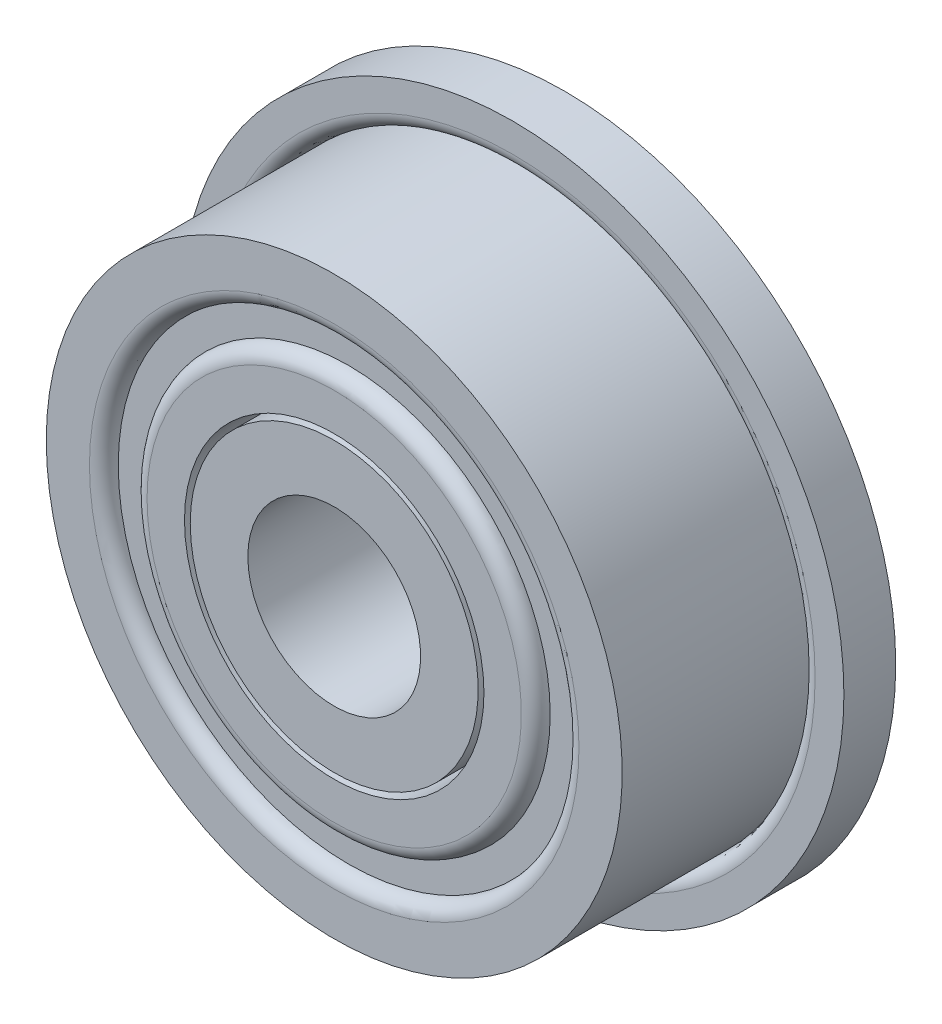
ISO-10303-21;
HEADER;
FILE_DESCRIPTION(('STEP AP214'),'2;1');
FILE_NAME('part.step','',(''),(''),'','','');
FILE_SCHEMA(('AUTOMOTIVE_DESIGN { 1 0 10303 214 1 1 1 1 }'));
ENDSEC;
DATA;
#1=APPLICATION_CONTEXT('core data for automotive mechanical design processes');
#2=APPLICATION_PROTOCOL_DEFINITION('international standard','automotive_design',2000,#1);
#3=PRODUCT_CONTEXT('',#1,'mechanical');
#4=PRODUCT('Part','Part','',(#3));
#5=PRODUCT_RELATED_PRODUCT_CATEGORY('part','',(#4));
#6=PRODUCT_DEFINITION_FORMATION('','',#4);
#7=PRODUCT_DEFINITION_CONTEXT('part definition',#1,'design');
#8=PRODUCT_DEFINITION('design','',#6,#7);
#9=PRODUCT_DEFINITION_SHAPE('','',#8);
#10=(LENGTH_UNIT() NAMED_UNIT(*) SI_UNIT(.MILLI.,.METRE.));
#11=(NAMED_UNIT(*) PLANE_ANGLE_UNIT() SI_UNIT($,.RADIAN.));
#12=(NAMED_UNIT(*) SI_UNIT($,.STERADIAN.) SOLID_ANGLE_UNIT());
#13=UNCERTAINTY_MEASURE_WITH_UNIT(LENGTH_MEASURE(1.E-05),#10,'distance_accuracy_value','');
#14=(GEOMETRIC_REPRESENTATION_CONTEXT(3) GLOBAL_UNCERTAINTY_ASSIGNED_CONTEXT((#13)) GLOBAL_UNIT_ASSIGNED_CONTEXT((#10,
#11,#12)) REPRESENTATION_CONTEXT('',''));
#15=CARTESIAN_POINT('',(0.,0.,0.));
#16=DIRECTION('',(0.,0.,1.));
#17=DIRECTION('',(1.,0.,0.));
#18=AXIS2_PLACEMENT_3D('',#15,#16,#17);
#19=CARTESIAN_POINT('',(0.,0.,0.));
#20=DIRECTION('',(0.,0.,1.));
#21=DIRECTION('',(1.,0.,0.));
#22=AXIS2_PLACEMENT_3D('',#19,#20,#21);
#23=CYLINDRICAL_SURFACE('',#22,2.5);
#24=CARTESIAN_POINT('',(0.,0.,2.));
#25=DIRECTION('',(0.,0.,-1.));
#26=DIRECTION('',(1.,0.,0.));
#27=AXIS2_PLACEMENT_3D('',#24,#25,#26);
#28=CIRCLE('',#27,2.5);
#29=CARTESIAN_POINT('',(-2.5,0.,2.));
#30=VERTEX_POINT('',#29);
#31=EDGE_CURVE('E10',#30,#30,#28,.T.);
#32=ORIENTED_EDGE('',*,*,#31,.T.);
#33=DIRECTION('',(0.,0.,-1.));
#34=VECTOR('',#33,1.);
#35=CARTESIAN_POINT('',(-2.5,0.,0.));
#36=LINE('',#35,#34);
#37=CARTESIAN_POINT('',(-2.5,0.,0.));
#38=VERTEX_POINT('',#37);
#39=EDGE_CURVE('E27',#30,#38,#36,.T.);
#40=ORIENTED_EDGE('',*,*,#39,.T.);
#41=CARTESIAN_POINT('',(0.,0.,0.));
#42=DIRECTION('',(0.,0.,1.));
#43=DIRECTION('',(1.,0.,0.));
#44=AXIS2_PLACEMENT_3D('',#41,#42,#43);
#45=CIRCLE('',#44,2.5);
#46=EDGE_CURVE('E255',#38,#38,#45,.T.);
#47=ORIENTED_EDGE('',*,*,#46,.T.);
#48=ORIENTED_EDGE('',*,*,#39,.F.);
#49=EDGE_LOOP('',(#32,#40,#47,#48));
#50=FACE_BOUND('',#49,.T.);
#51=ADVANCED_FACE('F16',(#50),#23,.T.);
#52=CARTESIAN_POINT('',(0.,0.,0.));
#53=DIRECTION('',(0.,0.,1.));
#54=DIRECTION('',(1.,0.,0.));
#55=AXIS2_PLACEMENT_3D('',#52,#53,#54);
#56=CYLINDRICAL_SURFACE('',#55,2.5);
#57=CARTESIAN_POINT('',(0.,0.,4.));
#58=DIRECTION('',(0.,0.,1.));
#59=DIRECTION('',(1.,0.,0.));
#60=AXIS2_PLACEMENT_3D('',#57,#58,#59);
#61=CIRCLE('',#60,2.5);
#62=CARTESIAN_POINT('',(-2.5,0.,4.));
#63=VERTEX_POINT('',#62);
#64=EDGE_CURVE('E221',#63,#63,#61,.T.);
#65=ORIENTED_EDGE('',*,*,#64,.F.);
#66=DIRECTION('',(0.,0.,-1.));
#67=VECTOR('',#66,1.);
#68=CARTESIAN_POINT('',(-2.5,0.,0.));
#69=LINE('',#68,#67);
#70=CARTESIAN_POINT('',(-2.5,0.,2.1));
#71=VERTEX_POINT('',#70);
#72=EDGE_CURVE('E251',#63,#71,#69,.T.);
#73=ORIENTED_EDGE('',*,*,#72,.T.);
#74=CARTESIAN_POINT('',(0.,0.,2.1));
#75=DIRECTION('',(0.,0.,-1.));
#76=DIRECTION('',(1.,0.,0.));
#77=AXIS2_PLACEMENT_3D('',#74,#75,#76);
#78=CIRCLE('',#77,2.5);
#79=EDGE_CURVE('E263',#71,#71,#78,.T.);
#80=ORIENTED_EDGE('',*,*,#79,.F.);
#81=ORIENTED_EDGE('',*,*,#72,.F.);
#82=EDGE_LOOP('',(#65,#73,#80,#81));
#83=FACE_BOUND('',#82,.T.);
#84=ADVANCED_FACE('F320',(#83),#56,.T.);
#85=CARTESIAN_POINT('',(0.,0.,0.));
#86=DIRECTION('',(0.,0.,1.));
#87=DIRECTION('',(1.,0.,0.));
#88=AXIS2_PLACEMENT_3D('',#85,#86,#87);
#89=CYLINDRICAL_SURFACE('',#88,1.5);
#90=CARTESIAN_POINT('',(0.,0.,4.));
#91=DIRECTION('',(0.,0.,-1.));
#92=DIRECTION('',(1.,0.,0.));
#93=AXIS2_PLACEMENT_3D('',#90,#91,#92);
#94=CIRCLE('',#93,1.5);
#95=CARTESIAN_POINT('',(-1.5,0.,4.));
#96=VERTEX_POINT('',#95);
#97=EDGE_CURVE('E270',#96,#96,#94,.T.);
#98=ORIENTED_EDGE('',*,*,#97,.F.);
#99=DIRECTION('',(0.,0.,-1.));
#100=VECTOR('',#99,1.);
#101=CARTESIAN_POINT('',(-1.5,0.,0.));
#102=LINE('',#101,#100);
#103=CARTESIAN_POINT('',(-1.5,0.,0.));
#104=VERTEX_POINT('',#103);
#105=EDGE_CURVE('E220',#96,#104,#102,.T.);
#106=ORIENTED_EDGE('',*,*,#105,.T.);
#107=CARTESIAN_POINT('',(0.,0.,0.));
#108=DIRECTION('',(0.,0.,-1.));
#109=DIRECTION('',(1.,0.,0.));
#110=AXIS2_PLACEMENT_3D('',#107,#108,#109);
#111=CIRCLE('',#110,1.5);
#112=EDGE_CURVE('E216',#104,#104,#111,.T.);
#113=ORIENTED_EDGE('',*,*,#112,.T.);
#114=ORIENTED_EDGE('',*,*,#105,.F.);
#115=EDGE_LOOP('',(#98,#106,#113,#114));
#116=FACE_BOUND('',#115,.T.);
#117=ADVANCED_FACE('F325',(#116),#89,.F.);
#118=CARTESIAN_POINT('',(0.,0.,4.));
#119=DIRECTION('',(0.,0.,1.));
#120=DIRECTION('',(1.,0.,0.));
#121=AXIS2_PLACEMENT_3D('',#118,#119,#120);
#122=PLANE('',#121);
#123=ORIENTED_EDGE('',*,*,#64,.T.);
#124=EDGE_LOOP('',(#123));
#125=FACE_BOUND('',#124,.T.);
#126=ORIENTED_EDGE('',*,*,#97,.T.);
#127=EDGE_LOOP('',(#126));
#128=FACE_BOUND('',#127,.T.);
#129=ADVANCED_FACE('F322',(#125,#128),#122,.T.);
#130=CARTESIAN_POINT('',(0.,0.,0.));
#131=DIRECTION('',(0.,0.,1.));
#132=DIRECTION('',(1.,0.,0.));
#133=AXIS2_PLACEMENT_3D('',#130,#131,#132);
#134=PLANE('',#133);
#135=ORIENTED_EDGE('',*,*,#46,.F.);
#136=EDGE_LOOP('',(#135));
#137=FACE_BOUND('',#136,.T.);
#138=ORIENTED_EDGE('',*,*,#112,.F.);
#139=EDGE_LOOP('',(#138));
#140=FACE_BOUND('',#139,.T.);
#141=ADVANCED_FACE('F316',(#137,#140),#134,.F.);
#142=CARTESIAN_POINT('',(0.,0.,2.1));
#143=DIRECTION('',(0.,0.,1.));
#144=DIRECTION('',(1.,0.,0.));
#145=AXIS2_PLACEMENT_3D('',#142,#143,#144);
#146=PLANE('',#145);
#147=CARTESIAN_POINT('',(0.,0.,2.1));
#148=DIRECTION('',(0.,0.,-1.));
#149=DIRECTION('',(1.,0.,0.));
#150=AXIS2_PLACEMENT_3D('',#147,#148,#149);
#151=CIRCLE('',#150,2.6);
#152=CARTESIAN_POINT('',(-2.6,0.,2.1));
#153=VERTEX_POINT('',#152);
#154=EDGE_CURVE('E183',#153,#153,#151,.T.);
#155=ORIENTED_EDGE('',*,*,#154,.F.);
#156=EDGE_LOOP('',(#155));
#157=FACE_BOUND('',#156,.T.);
#158=ORIENTED_EDGE('',*,*,#79,.T.);
#159=EDGE_LOOP('',(#158));
#160=FACE_BOUND('',#159,.T.);
#161=ADVANCED_FACE('F312',(#157,#160),#146,.T.);
#162=CARTESIAN_POINT('',(0.,0.,2.));
#163=DIRECTION('',(0.,0.,1.));
#164=DIRECTION('',(1.,0.,0.));
#165=AXIS2_PLACEMENT_3D('',#162,#163,#164);
#166=PLANE('',#165);
#167=CARTESIAN_POINT('',(0.,0.,2.));
#168=DIRECTION('',(0.,0.,1.));
#169=DIRECTION('',(1.,0.,0.));
#170=AXIS2_PLACEMENT_3D('',#167,#168,#169);
#171=CIRCLE('',#170,2.6);
#172=CARTESIAN_POINT('',(-2.6,0.,2.));
#173=VERTEX_POINT('',#172);
#174=EDGE_CURVE('E259',#173,#173,#171,.T.);
#175=ORIENTED_EDGE('',*,*,#174,.F.);
#176=EDGE_LOOP('',(#175));
#177=FACE_BOUND('',#176,.T.);
#178=ORIENTED_EDGE('',*,*,#31,.F.);
#179=EDGE_LOOP('',(#178));
#180=FACE_BOUND('',#179,.T.);
#181=ADVANCED_FACE('F315',(#177,#180),#166,.F.);
#182=CARTESIAN_POINT('',(0.,0.,0.));
#183=DIRECTION('',(0.,0.,1.));
#184=DIRECTION('',(1.,0.,0.));
#185=AXIS2_PLACEMENT_3D('',#182,#183,#184);
#186=CYLINDRICAL_SURFACE('',#185,2.6);
#187=ORIENTED_EDGE('',*,*,#174,.T.);
#188=DIRECTION('',(0.,0.,-1.));
#189=VECTOR('',#188,1.);
#190=CARTESIAN_POINT('',(-2.6,0.,0.));
#191=LINE('',#190,#189);
#192=CARTESIAN_POINT('',(-2.6,0.,0.));
#193=VERTEX_POINT('',#192);
#194=EDGE_CURVE('E232',#173,#193,#191,.T.);
#195=ORIENTED_EDGE('',*,*,#194,.T.);
#196=CARTESIAN_POINT('',(0.,0.,0.));
#197=DIRECTION('',(0.,0.,-1.));
#198=DIRECTION('',(1.,0.,0.));
#199=AXIS2_PLACEMENT_3D('',#196,#197,#198);
#200=CIRCLE('',#199,2.6);
#201=EDGE_CURVE('E214',#193,#193,#200,.T.);
#202=ORIENTED_EDGE('',*,*,#201,.T.);
#203=ORIENTED_EDGE('',*,*,#194,.F.);
#204=EDGE_LOOP('',(#187,#195,#202,#203));
#205=FACE_BOUND('',#204,.T.);
#206=ADVANCED_FACE('F340',(#205),#186,.F.);
#207=CARTESIAN_POINT('',(0.,0.,3.75));
#208=DIRECTION('',(0.,0.,1.));
#209=DIRECTION('',(1.,0.,0.));
#210=AXIS2_PLACEMENT_3D('',#207,#208,#209);
#211=PLANE('',#210);
#212=CARTESIAN_POINT('',(0.,0.,3.75));
#213=DIRECTION('',(0.,0.,-1.));
#214=DIRECTION('',(1.,0.,0.));
#215=AXIS2_PLACEMENT_3D('',#212,#213,#214);
#216=CIRCLE('',#215,4.);
#217=CARTESIAN_POINT('',(-4.,0.,3.75));
#218=VERTEX_POINT('',#217);
#219=CARTESIAN_POINT('',(4.,0.,3.75));
#220=VERTEX_POINT('',#219);
#221=EDGE_CURVE('E20',#218,#220,#216,.T.);
#222=ORIENTED_EDGE('',*,*,#221,.F.);
#223=CARTESIAN_POINT('',(0.,0.,3.75));
#224=DIRECTION('',(0.,0.,-1.));
#225=DIRECTION('',(1.,0.,0.));
#226=AXIS2_PLACEMENT_3D('',#223,#224,#225);
#227=CIRCLE('',#226,4.);
#228=EDGE_CURVE('E167',#220,#218,#227,.T.);
#229=ORIENTED_EDGE('',*,*,#228,.F.);
#230=EDGE_LOOP('',(#222,#229));
#231=FACE_BOUND('',#230,.T.);
#232=CARTESIAN_POINT('',(0.,0.,3.75));
#233=DIRECTION('',(0.,0.,1.));
#234=DIRECTION('',(1.,0.,0.));
#235=AXIS2_PLACEMENT_3D('',#232,#233,#234);
#236=CIRCLE('',#235,3.5);
#237=CARTESIAN_POINT('',(-3.5,0.,3.75));
#238=VERTEX_POINT('',#237);
#239=EDGE_CURVE('E225',#238,#238,#236,.T.);
#240=ORIENTED_EDGE('',*,*,#239,.F.);
#241=EDGE_LOOP('',(#240));
#242=FACE_BOUND('',#241,.T.);
#243=ADVANCED_FACE('F348',(#231,#242),#211,.T.);
#244=CARTESIAN_POINT('',(0.,0.,3.75));
#245=DIRECTION('',(0.,0.,1.));
#246=DIRECTION('',(1.,0.,0.));
#247=AXIS2_PLACEMENT_3D('',#244,#245,#246);
#248=TOROIDAL_SURFACE('',#247,3.25,0.25);
#249=CARTESIAN_POINT('',(0.,0.,4.));
#250=DIRECTION('',(0.,0.,-1.));
#251=DIRECTION('',(1.,0.,0.));
#252=AXIS2_PLACEMENT_3D('',#249,#250,#251);
#253=CIRCLE('',#252,3.25);
#254=CARTESIAN_POINT('',(-3.25,0.,4.));
#255=VERTEX_POINT('',#254);
#256=EDGE_CURVE('E210',#255,#255,#253,.T.);
#257=ORIENTED_EDGE('',*,*,#256,.T.);
#258=CARTESIAN_POINT('',(-3.25,0.,3.75));
#259=DIRECTION('',(0.,-1.,0.));
#260=DIRECTION('',(-1.,0.,0.));
#261=AXIS2_PLACEMENT_3D('',#258,#259,#260);
#262=CIRCLE('',#261,0.25);
#263=EDGE_CURVE('E215',#255,#238,#262,.T.);
#264=ORIENTED_EDGE('',*,*,#263,.T.);
#265=ORIENTED_EDGE('',*,*,#239,.T.);
#266=ORIENTED_EDGE('',*,*,#263,.F.);
#267=EDGE_LOOP('',(#257,#264,#265,#266));
#268=FACE_BOUND('',#267,.T.);
#269=ADVANCED_FACE('F302',(#268),#248,.T.);
#270=CARTESIAN_POINT('',(0.,0.,4.));
#271=DIRECTION('',(0.,0.,1.));
#272=DIRECTION('',(1.,0.,0.));
#273=AXIS2_PLACEMENT_3D('',#270,#271,#272);
#274=PLANE('',#273);
#275=ORIENTED_EDGE('',*,*,#256,.F.);
#276=EDGE_LOOP('',(#275));
#277=FACE_BOUND('',#276,.T.);
#278=CARTESIAN_POINT('',(0.,0.,4.));
#279=DIRECTION('',(0.,0.,-1.));
#280=DIRECTION('',(1.,0.,0.));
#281=AXIS2_PLACEMENT_3D('',#278,#279,#280);
#282=CIRCLE('',#281,2.6);
#283=CARTESIAN_POINT('',(-2.6,0.,4.));
#284=VERTEX_POINT('',#283);
#285=EDGE_CURVE('E155',#284,#284,#282,.T.);
#286=ORIENTED_EDGE('',*,*,#285,.T.);
#287=EDGE_LOOP('',(#286));
#288=FACE_BOUND('',#287,.T.);
#289=ADVANCED_FACE('F304',(#277,#288),#274,.T.);
#290=CARTESIAN_POINT('',(0.,0.,3.75));
#291=DIRECTION('',(0.,0.,-1.));
#292=DIRECTION('',(-1.,0.,0.));
#293=AXIS2_PLACEMENT_3D('',#290,#291,#292);
#294=TOROIDAL_SURFACE('',#293,4.25,0.25);
#295=CARTESIAN_POINT('',(0.,0.,4.));
#296=DIRECTION('',(0.,0.,1.));
#297=DIRECTION('',(1.,0.,0.));
#298=AXIS2_PLACEMENT_3D('',#295,#296,#297);
#299=CIRCLE('',#298,4.25);
#300=CARTESIAN_POINT('',(-4.25,0.,4.));
#301=VERTEX_POINT('',#300);
#302=CARTESIAN_POINT('',(4.25,0.,4.));
#303=VERTEX_POINT('',#302);
#304=EDGE_CURVE('E148',#301,#303,#299,.T.);
#305=ORIENTED_EDGE('',*,*,#304,.T.);
#306=CARTESIAN_POINT('',(4.25,0.,3.75));
#307=DIRECTION('',(0.,-1.,0.));
#308=DIRECTION('',(1.,0.,0.));
#309=AXIS2_PLACEMENT_3D('',#306,#307,#308);
#310=CIRCLE('',#309,0.25);
#311=EDGE_CURVE('E156',#303,#220,#310,.T.);
#312=ORIENTED_EDGE('',*,*,#311,.T.);
#313=ORIENTED_EDGE('',*,*,#228,.T.);
#314=ORIENTED_EDGE('',*,*,#221,.T.);
#315=ORIENTED_EDGE('',*,*,#311,.F.);
#316=CARTESIAN_POINT('',(0.,0.,4.));
#317=DIRECTION('',(0.,0.,1.));
#318=DIRECTION('',(1.,0.,0.));
#319=AXIS2_PLACEMENT_3D('',#316,#317,#318);
#320=CIRCLE('',#319,4.25);
#321=EDGE_CURVE('E151',#303,#301,#320,.T.);
#322=ORIENTED_EDGE('',*,*,#321,.T.);
#323=EDGE_LOOP('',(#305,#312,#313,#314,#315,#322));
#324=FACE_BOUND('',#323,.T.);
#325=ADVANCED_FACE('F158',(#324),#294,.T.);
#326=CARTESIAN_POINT('',(0.,0.,4.));
#327=DIRECTION('',(0.,0.,1.));
#328=DIRECTION('',(1.,0.,0.));
#329=AXIS2_PLACEMENT_3D('',#326,#327,#328);
#330=PLANE('',#329);
#331=CARTESIAN_POINT('',(0.,0.,4.));
#332=DIRECTION('',(0.,0.,1.));
#333=DIRECTION('',(1.,0.,0.));
#334=AXIS2_PLACEMENT_3D('',#331,#332,#333);
#335=CIRCLE('',#334,5.);
#336=CARTESIAN_POINT('',(-5.,0.,4.));
#337=VERTEX_POINT('',#336);
#338=EDGE_CURVE('E160',#337,#337,#335,.T.);
#339=ORIENTED_EDGE('',*,*,#338,.T.);
#340=EDGE_LOOP('',(#339));
#341=FACE_BOUND('',#340,.T.);
#342=ORIENTED_EDGE('',*,*,#304,.F.);
#343=ORIENTED_EDGE('',*,*,#321,.F.);
#344=EDGE_LOOP('',(#342,#343));
#345=FACE_BOUND('',#344,.T.);
#346=ADVANCED_FACE('F150',(#341,#345),#330,.T.);
#347=CARTESIAN_POINT('',(0.,0.,0.25));
#348=DIRECTION('',(0.,0.,1.));
#349=DIRECTION('',(1.,0.,0.));
#350=AXIS2_PLACEMENT_3D('',#347,#348,#349);
#351=TOROIDAL_SURFACE('',#350,3.25,0.25);
#352=CARTESIAN_POINT('',(0.,0.,0.25));
#353=DIRECTION('',(0.,0.,-1.));
#354=DIRECTION('',(1.,0.,0.));
#355=AXIS2_PLACEMENT_3D('',#352,#353,#354);
#356=CIRCLE('',#355,3.5);
#357=CARTESIAN_POINT('',(-3.5,0.,0.25));
#358=VERTEX_POINT('',#357);
#359=EDGE_CURVE('E169',#358,#358,#356,.T.);
#360=ORIENTED_EDGE('',*,*,#359,.T.);
#361=CARTESIAN_POINT('',(-3.25,0.,0.25));
#362=DIRECTION('',(0.,-1.,0.));
#363=DIRECTION('',(-1.,0.,0.));
#364=AXIS2_PLACEMENT_3D('',#361,#362,#363);
#365=CIRCLE('',#364,0.25);
#366=CARTESIAN_POINT('',(-3.25,0.,0.));
#367=VERTEX_POINT('',#366);
#368=EDGE_CURVE('E174',#358,#367,#365,.T.);
#369=ORIENTED_EDGE('',*,*,#368,.T.);
#370=CARTESIAN_POINT('',(0.,0.,0.));
#371=DIRECTION('',(0.,0.,1.));
#372=DIRECTION('',(1.,0.,0.));
#373=AXIS2_PLACEMENT_3D('',#370,#371,#372);
#374=CIRCLE('',#373,3.25);
#375=EDGE_CURVE('E178',#367,#367,#374,.T.);
#376=ORIENTED_EDGE('',*,*,#375,.T.);
#377=ORIENTED_EDGE('',*,*,#368,.F.);
#378=EDGE_LOOP('',(#360,#369,#376,#377));
#379=FACE_BOUND('',#378,.T.);
#380=ADVANCED_FACE('F18',(#379),#351,.T.);
#381=CARTESIAN_POINT('',(0.,0.,0.));
#382=DIRECTION('',(0.,0.,1.));
#383=DIRECTION('',(1.,0.,0.));
#384=AXIS2_PLACEMENT_3D('',#381,#382,#383);
#385=PLANE('',#384);
#386=ORIENTED_EDGE('',*,*,#375,.F.);
#387=EDGE_LOOP('',(#386));
#388=FACE_BOUND('',#387,.T.);
#389=ORIENTED_EDGE('',*,*,#201,.F.);
#390=EDGE_LOOP('',(#389));
#391=FACE_BOUND('',#390,.T.);
#392=ADVANCED_FACE('F384',(#388,#391),#385,.F.);
#393=CARTESIAN_POINT('',(0.,0.,0.));
#394=DIRECTION('',(0.,0.,1.));
#395=DIRECTION('',(1.,0.,0.));
#396=AXIS2_PLACEMENT_3D('',#393,#394,#395);
#397=CYLINDRICAL_SURFACE('',#396,2.6);
#398=ORIENTED_EDGE('',*,*,#285,.F.);
#399=DIRECTION('',(0.,0.,-1.));
#400=VECTOR('',#399,1.);
#401=CARTESIAN_POINT('',(-2.6,0.,0.));
#402=LINE('',#401,#400);
#403=EDGE_CURVE('E236',#284,#153,#402,.T.);
#404=ORIENTED_EDGE('',*,*,#403,.T.);
#405=ORIENTED_EDGE('',*,*,#154,.T.);
#406=ORIENTED_EDGE('',*,*,#403,.F.);
#407=EDGE_LOOP('',(#398,#404,#405,#406));
#408=FACE_BOUND('',#407,.T.);
#409=ADVANCED_FACE('F310',(#408),#397,.F.);
#410=CARTESIAN_POINT('',(0.,0.,0.25));
#411=DIRECTION('',(0.,0.,1.));
#412=DIRECTION('',(1.,0.,0.));
#413=AXIS2_PLACEMENT_3D('',#410,#411,#412);
#414=PLANE('',#413);
#415=CARTESIAN_POINT('',(0.,0.,0.25));
#416=DIRECTION('',(0.,0.,1.));
#417=DIRECTION('',(1.,0.,0.));
#418=AXIS2_PLACEMENT_3D('',#415,#416,#417);
#419=CIRCLE('',#418,4.);
#420=CARTESIAN_POINT('',(-4.,0.,0.25));
#421=VERTEX_POINT('',#420);
#422=CARTESIAN_POINT('',(4.,0.,0.25));
#423=VERTEX_POINT('',#422);
#424=EDGE_CURVE('E179',#421,#423,#419,.T.);
#425=ORIENTED_EDGE('',*,*,#424,.F.);
#426=CARTESIAN_POINT('',(0.,0.,0.25));
#427=DIRECTION('',(0.,0.,1.));
#428=DIRECTION('',(1.,0.,0.));
#429=AXIS2_PLACEMENT_3D('',#426,#427,#428);
#430=CIRCLE('',#429,4.);
#431=EDGE_CURVE('E193',#423,#421,#430,.T.);
#432=ORIENTED_EDGE('',*,*,#431,.F.);
#433=EDGE_LOOP('',(#425,#432));
#434=FACE_BOUND('',#433,.T.);
#435=ORIENTED_EDGE('',*,*,#359,.F.);
#436=EDGE_LOOP('',(#435));
#437=FACE_BOUND('',#436,.T.);
#438=ADVANCED_FACE('F391',(#434,#437),#414,.F.);
#439=CARTESIAN_POINT('',(0.,0.,0.25));
#440=DIRECTION('',(0.,0.,-1.));
#441=DIRECTION('',(-1.,0.,0.));
#442=AXIS2_PLACEMENT_3D('',#439,#440,#441);
#443=TOROIDAL_SURFACE('',#442,4.25,0.25);
#444=ORIENTED_EDGE('',*,*,#424,.T.);
#445=CARTESIAN_POINT('',(4.25,0.,0.25));
#446=DIRECTION('',(0.,-1.,0.));
#447=DIRECTION('',(1.,0.,0.));
#448=AXIS2_PLACEMENT_3D('',#445,#446,#447);
#449=CIRCLE('',#448,0.25);
#450=CARTESIAN_POINT('',(4.25,0.,0.));
#451=VERTEX_POINT('',#450);
#452=EDGE_CURVE('E184',#423,#451,#449,.T.);
#453=ORIENTED_EDGE('',*,*,#452,.T.);
#454=CARTESIAN_POINT('',(0.,0.,0.));
#455=DIRECTION('',(0.,0.,-1.));
#456=DIRECTION('',(1.,0.,0.));
#457=AXIS2_PLACEMENT_3D('',#454,#455,#456);
#458=CIRCLE('',#457,4.25);
#459=CARTESIAN_POINT('',(-4.25,0.,0.));
#460=VERTEX_POINT('',#459);
#461=EDGE_CURVE('E256',#451,#460,#458,.T.);
#462=ORIENTED_EDGE('',*,*,#461,.T.);
#463=CARTESIAN_POINT('',(0.,0.,0.));
#464=DIRECTION('',(0.,0.,-1.));
#465=DIRECTION('',(1.,0.,0.));
#466=AXIS2_PLACEMENT_3D('',#463,#464,#465);
#467=CIRCLE('',#466,4.25);
#468=EDGE_CURVE('E196',#460,#451,#467,.T.);
#469=ORIENTED_EDGE('',*,*,#468,.T.);
#470=ORIENTED_EDGE('',*,*,#452,.F.);
#471=ORIENTED_EDGE('',*,*,#431,.T.);
#472=EDGE_LOOP('',(#444,#453,#462,#469,#470,#471));
#473=FACE_BOUND('',#472,.T.);
#474=ADVANCED_FACE('F371',(#473),#443,.T.);
#475=CARTESIAN_POINT('',(0.,0.,0.));
#476=DIRECTION('',(0.,0.,1.));
#477=DIRECTION('',(1.,0.,0.));
#478=AXIS2_PLACEMENT_3D('',#475,#476,#477);
#479=PLANE('',#478);
#480=CARTESIAN_POINT('',(0.,0.,0.));
#481=DIRECTION('',(0.,0.,1.));
#482=DIRECTION('',(1.,0.,0.));
#483=AXIS2_PLACEMENT_3D('',#480,#481,#482);
#484=CIRCLE('',#483,5.75);
#485=CARTESIAN_POINT('',(-5.75,0.,0.));
#486=VERTEX_POINT('',#485);
#487=EDGE_CURVE('E185',#486,#486,#484,.T.);
#488=ORIENTED_EDGE('',*,*,#487,.F.);
#489=EDGE_LOOP('',(#488));
#490=FACE_BOUND('',#489,.T.);
#491=ORIENTED_EDGE('',*,*,#468,.F.);
#492=ORIENTED_EDGE('',*,*,#461,.F.);
#493=EDGE_LOOP('',(#491,#492));
#494=FACE_BOUND('',#493,.T.);
#495=ADVANCED_FACE('F362',(#490,#494),#479,.F.);
#496=CARTESIAN_POINT('',(0.,0.,0.));
#497=DIRECTION('',(0.,0.,1.));
#498=DIRECTION('',(1.,0.,0.));
#499=AXIS2_PLACEMENT_3D('',#496,#497,#498);
#500=CYLINDRICAL_SURFACE('',#499,5.);
#501=ORIENTED_EDGE('',*,*,#338,.F.);
#502=DIRECTION('',(0.,0.,-1.));
#503=VECTOR('',#502,1.);
#504=CARTESIAN_POINT('',(-5.,0.,0.));
#505=LINE('',#504,#503);
#506=CARTESIAN_POINT('',(-5.,0.,0.65));
#507=VERTEX_POINT('',#506);
#508=EDGE_CURVE('E197',#337,#507,#505,.T.);
#509=ORIENTED_EDGE('',*,*,#508,.T.);
#510=CARTESIAN_POINT('',(0.,0.,0.65));
#511=DIRECTION('',(0.,0.,-1.));
#512=DIRECTION('',(1.,0.,0.));
#513=AXIS2_PLACEMENT_3D('',#510,#511,#512);
#514=CIRCLE('',#513,5.);
#515=CARTESIAN_POINT('',(5.,0.,0.65));
#516=VERTEX_POINT('',#515);
#517=EDGE_CURVE('E250',#516,#507,#514,.T.);
#518=ORIENTED_EDGE('',*,*,#517,.F.);
#519=CARTESIAN_POINT('',(0.,0.,0.65));
#520=DIRECTION('',(0.,0.,-1.));
#521=DIRECTION('',(1.,0.,0.));
#522=AXIS2_PLACEMENT_3D('',#519,#520,#521);
#523=CIRCLE('',#522,5.);
#524=EDGE_CURVE('E203',#507,#516,#523,.T.);
#525=ORIENTED_EDGE('',*,*,#524,.F.);
#526=ORIENTED_EDGE('',*,*,#508,.F.);
#527=EDGE_LOOP('',(#501,#509,#518,#525,#526));
#528=FACE_BOUND('',#527,.T.);
#529=ADVANCED_FACE('F359',(#528),#500,.T.);
#530=CARTESIAN_POINT('',(0.,0.,0.65));
#531=DIRECTION('',(0.,0.,-1.));
#532=DIRECTION('',(-1.,0.,0.));
#533=AXIS2_PLACEMENT_3D('',#530,#531,#532);
#534=TOROIDAL_SURFACE('',#533,5.25,0.25);
#535=CARTESIAN_POINT('',(0.,0.,0.9));
#536=DIRECTION('',(0.,0.,1.));
#537=DIRECTION('',(1.,0.,0.));
#538=AXIS2_PLACEMENT_3D('',#535,#536,#537);
#539=CIRCLE('',#538,5.25);
#540=CARTESIAN_POINT('',(-5.25,0.,0.9));
#541=VERTEX_POINT('',#540);
#542=CARTESIAN_POINT('',(5.25,0.,0.9));
#543=VERTEX_POINT('',#542);
#544=EDGE_CURVE('E205',#541,#543,#539,.T.);
#545=ORIENTED_EDGE('',*,*,#544,.T.);
#546=CARTESIAN_POINT('',(5.25,0.,0.65));
#547=DIRECTION('',(0.,-1.,0.));
#548=DIRECTION('',(1.,0.,0.));
#549=AXIS2_PLACEMENT_3D('',#546,#547,#548);
#550=CIRCLE('',#549,0.25);
#551=EDGE_CURVE('E209',#543,#516,#550,.T.);
#552=ORIENTED_EDGE('',*,*,#551,.T.);
#553=ORIENTED_EDGE('',*,*,#517,.T.);
#554=ORIENTED_EDGE('',*,*,#524,.T.);
#555=ORIENTED_EDGE('',*,*,#551,.F.);
#556=CARTESIAN_POINT('',(0.,0.,0.9));
#557=DIRECTION('',(0.,0.,1.));
#558=DIRECTION('',(1.,0.,0.));
#559=AXIS2_PLACEMENT_3D('',#556,#557,#558);
#560=CIRCLE('',#559,5.25);
#561=EDGE_CURVE('E199',#543,#541,#560,.T.);
#562=ORIENTED_EDGE('',*,*,#561,.T.);
#563=EDGE_LOOP('',(#545,#552,#553,#554,#555,#562));
#564=FACE_BOUND('',#563,.T.);
#565=ADVANCED_FACE('F361',(#564),#534,.T.);
#566=CARTESIAN_POINT('',(0.,0.,0.9));
#567=DIRECTION('',(0.,0.,1.));
#568=DIRECTION('',(1.,0.,0.));
#569=AXIS2_PLACEMENT_3D('',#566,#567,#568);
#570=PLANE('',#569);
#571=CARTESIAN_POINT('',(0.,0.,0.9));
#572=DIRECTION('',(0.,0.,1.));
#573=DIRECTION('',(1.,0.,0.));
#574=AXIS2_PLACEMENT_3D('',#571,#572,#573);
#575=CIRCLE('',#574,5.75);
#576=CARTESIAN_POINT('',(-5.75,0.,0.9));
#577=VERTEX_POINT('',#576);
#578=EDGE_CURVE('E204',#577,#577,#575,.T.);
#579=ORIENTED_EDGE('',*,*,#578,.T.);
#580=EDGE_LOOP('',(#579));
#581=FACE_BOUND('',#580,.T.);
#582=ORIENTED_EDGE('',*,*,#544,.F.);
#583=ORIENTED_EDGE('',*,*,#561,.F.);
#584=EDGE_LOOP('',(#582,#583));
#585=FACE_BOUND('',#584,.T.);
#586=ADVANCED_FACE('F368',(#581,#585),#570,.T.);
#587=CARTESIAN_POINT('',(0.,0.,0.));
#588=DIRECTION('',(0.,0.,1.));
#589=DIRECTION('',(1.,0.,0.));
#590=AXIS2_PLACEMENT_3D('',#587,#588,#589);
#591=CYLINDRICAL_SURFACE('',#590,5.75);
#592=ORIENTED_EDGE('',*,*,#578,.F.);
#593=DIRECTION('',(0.,0.,-1.));
#594=VECTOR('',#593,1.);
#595=CARTESIAN_POINT('',(-5.75,0.,0.));
#596=LINE('',#595,#594);
#597=EDGE_CURVE('E189',#577,#486,#596,.T.);
#598=ORIENTED_EDGE('',*,*,#597,.T.);
#599=ORIENTED_EDGE('',*,*,#487,.T.);
#600=ORIENTED_EDGE('',*,*,#597,.F.);
#601=EDGE_LOOP('',(#592,#598,#599,#600));
#602=FACE_BOUND('',#601,.T.);
#603=ADVANCED_FACE('F395',(#602),#591,.T.);
#604=CLOSED_SHELL('',(#51,#84,#117,#129,#141,#161,#181,#206,#243,#269,#289,#325,#346,#380,#392,
#409,#438,#474,#495,#529,#565,#586,#603));
#605=MANIFOLD_SOLID_BREP('B1',#604);
#606=ADVANCED_BREP_SHAPE_REPRESENTATION('',(#18,#605),#14);
#607=SHAPE_DEFINITION_REPRESENTATION(#9,#606);
ENDSEC;
END-ISO-10303-21;
